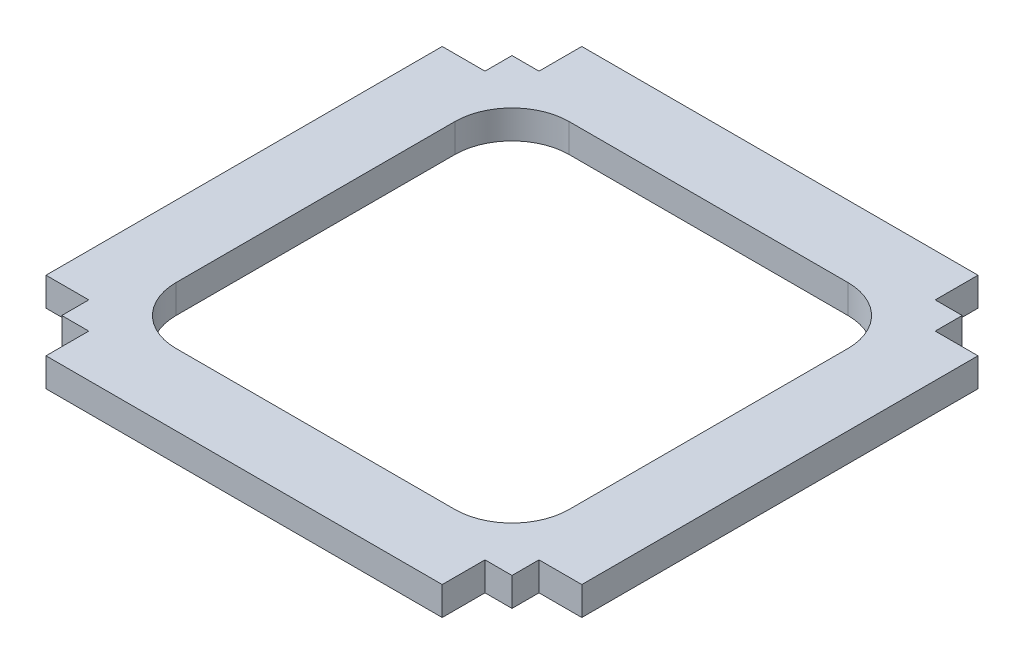
ISO-10303-21;
HEADER;
FILE_DESCRIPTION(('STEP AP214'),'2;1');
FILE_NAME('part.step','',(''),(''),'','','');
FILE_SCHEMA(('AUTOMOTIVE_DESIGN { 1 0 10303 214 1 1 1 1 }'));
ENDSEC;
DATA;
#1=APPLICATION_CONTEXT('core data for automotive mechanical design processes');
#2=APPLICATION_PROTOCOL_DEFINITION('international standard','automotive_design',2000,#1);
#3=PRODUCT_CONTEXT('',#1,'mechanical');
#4=PRODUCT('Part','Part','',(#3));
#5=PRODUCT_RELATED_PRODUCT_CATEGORY('part','',(#4));
#6=PRODUCT_DEFINITION_FORMATION('','',#4);
#7=PRODUCT_DEFINITION_CONTEXT('part definition',#1,'design');
#8=PRODUCT_DEFINITION('design','',#6,#7);
#9=PRODUCT_DEFINITION_SHAPE('','',#8);
#10=(LENGTH_UNIT() NAMED_UNIT(*) SI_UNIT(.MILLI.,.METRE.));
#11=(NAMED_UNIT(*) PLANE_ANGLE_UNIT() SI_UNIT($,.RADIAN.));
#12=(NAMED_UNIT(*) SI_UNIT($,.STERADIAN.) SOLID_ANGLE_UNIT());
#13=UNCERTAINTY_MEASURE_WITH_UNIT(LENGTH_MEASURE(1.E-05),#10,'distance_accuracy_value','');
#14=(GEOMETRIC_REPRESENTATION_CONTEXT(3) GLOBAL_UNCERTAINTY_ASSIGNED_CONTEXT((#13)) GLOBAL_UNIT_ASSIGNED_CONTEXT((#10,
#11,#12)) REPRESENTATION_CONTEXT('',''));
#15=CARTESIAN_POINT('',(0.,0.,0.));
#16=DIRECTION('',(0.,0.,1.));
#17=DIRECTION('',(1.,0.,0.));
#18=AXIS2_PLACEMENT_3D('',#15,#16,#17);
#19=CARTESIAN_POINT('',(-50.,6.35,-44.));
#20=DIRECTION('',(1.,0.,0.));
#21=DIRECTION('',(0.,0.,-1.));
#22=AXIS2_PLACEMENT_3D('',#19,#20,#21);
#23=PLANE('',#22);
#24=DIRECTION('',(0.,0.,1.));
#25=VECTOR('',#24,1.);
#26=CARTESIAN_POINT('',(-50.,0.,-44.));
#27=LINE('',#26,#25);
#28=CARTESIAN_POINT('',(-50.,0.,-50.));
#29=VERTEX_POINT('',#28);
#30=CARTESIAN_POINT('',(-50.,0.,-44.));
#31=VERTEX_POINT('',#30);
#32=EDGE_CURVE('E243',#29,#31,#27,.T.);
#33=ORIENTED_EDGE('',*,*,#32,.T.);
#34=DIRECTION('',(0.,-1.,0.));
#35=VECTOR('',#34,1.);
#36=CARTESIAN_POINT('',(-50.,6.35,-44.));
#37=LINE('',#36,#35);
#38=CARTESIAN_POINT('',(-50.,6.35,-44.));
#39=VERTEX_POINT('',#38);
#40=EDGE_CURVE('E224',#39,#31,#37,.T.);
#41=ORIENTED_EDGE('',*,*,#40,.F.);
#42=DIRECTION('',(0.,0.,1.));
#43=VECTOR('',#42,1.);
#44=CARTESIAN_POINT('',(-50.,6.35,-44.));
#45=LINE('',#44,#43);
#46=CARTESIAN_POINT('',(-50.,6.35,-50.));
#47=VERTEX_POINT('',#46);
#48=EDGE_CURVE('E231',#47,#39,#45,.T.);
#49=ORIENTED_EDGE('',*,*,#48,.F.);
#50=DIRECTION('',(0.,-1.,0.));
#51=VECTOR('',#50,1.);
#52=CARTESIAN_POINT('',(-50.,6.35,-50.));
#53=LINE('',#52,#51);
#54=EDGE_CURVE('E349',#47,#29,#53,.T.);
#55=ORIENTED_EDGE('',*,*,#54,.T.);
#56=EDGE_LOOP('',(#33,#41,#49,#55));
#57=FACE_BOUND('',#56,.T.);
#58=ADVANCED_FACE('F34',(#57),#23,.F.);
#59=CARTESIAN_POINT('',(-50.,6.35,-44.));
#60=DIRECTION('',(0.,0.,1.));
#61=DIRECTION('',(1.,0.,0.));
#62=AXIS2_PLACEMENT_3D('',#59,#60,#61);
#63=PLANE('',#62);
#64=DIRECTION('',(-1.,0.,0.));
#65=VECTOR('',#64,1.);
#66=CARTESIAN_POINT('',(-50.,0.,-44.));
#67=LINE('',#66,#65);
#68=CARTESIAN_POINT('',(-59.5,0.,-44.));
#69=VERTEX_POINT('',#68);
#70=EDGE_CURVE('E351',#31,#69,#67,.T.);
#71=ORIENTED_EDGE('',*,*,#70,.T.);
#72=DIRECTION('',(0.,-1.,0.));
#73=VECTOR('',#72,1.);
#74=CARTESIAN_POINT('',(-59.5,6.35,-44.));
#75=LINE('',#74,#73);
#76=CARTESIAN_POINT('',(-59.5,6.35,-44.));
#77=VERTEX_POINT('',#76);
#78=EDGE_CURVE('E227',#77,#69,#75,.T.);
#79=ORIENTED_EDGE('',*,*,#78,.F.);
#80=DIRECTION('',(-1.,0.,0.));
#81=VECTOR('',#80,1.);
#82=CARTESIAN_POINT('',(-50.,6.35,-44.));
#83=LINE('',#82,#81);
#84=EDGE_CURVE('E220',#39,#77,#83,.T.);
#85=ORIENTED_EDGE('',*,*,#84,.F.);
#86=ORIENTED_EDGE('',*,*,#40,.T.);
#87=EDGE_LOOP('',(#71,#79,#85,#86));
#88=FACE_BOUND('',#87,.T.);
#89=ADVANCED_FACE('F222',(#88),#63,.F.);
#90=CARTESIAN_POINT('',(-59.5,6.35,44.));
#91=DIRECTION('',(1.,0.,0.));
#92=DIRECTION('',(0.,0.,-1.));
#93=AXIS2_PLACEMENT_3D('',#90,#91,#92);
#94=PLANE('',#93);
#95=DIRECTION('',(0.,0.,1.));
#96=VECTOR('',#95,1.);
#97=CARTESIAN_POINT('',(-59.5,0.,44.));
#98=LINE('',#97,#96);
#99=CARTESIAN_POINT('',(-59.5,0.,44.));
#100=VERTEX_POINT('',#99);
#101=EDGE_CURVE('E353',#69,#100,#98,.T.);
#102=ORIENTED_EDGE('',*,*,#101,.T.);
#103=DIRECTION('',(0.,-1.,0.));
#104=VECTOR('',#103,1.);
#105=CARTESIAN_POINT('',(-59.5,6.35,44.));
#106=LINE('',#105,#104);
#107=CARTESIAN_POINT('',(-59.5,6.35,44.));
#108=VERTEX_POINT('',#107);
#109=EDGE_CURVE('E248',#108,#100,#106,.T.);
#110=ORIENTED_EDGE('',*,*,#109,.F.);
#111=DIRECTION('',(0.,0.,1.));
#112=VECTOR('',#111,1.);
#113=CARTESIAN_POINT('',(-59.5,6.35,44.));
#114=LINE('',#113,#112);
#115=EDGE_CURVE('E230',#77,#108,#114,.T.);
#116=ORIENTED_EDGE('',*,*,#115,.F.);
#117=ORIENTED_EDGE('',*,*,#78,.T.);
#118=EDGE_LOOP('',(#102,#110,#116,#117));
#119=FACE_BOUND('',#118,.T.);
#120=ADVANCED_FACE('F458',(#119),#94,.F.);
#121=CARTESIAN_POINT('',(-50.,6.35,44.));
#122=DIRECTION('',(0.,0.,-1.));
#123=DIRECTION('',(-1.,0.,0.));
#124=AXIS2_PLACEMENT_3D('',#121,#122,#123);
#125=PLANE('',#124);
#126=DIRECTION('',(1.,0.,0.));
#127=VECTOR('',#126,1.);
#128=CARTESIAN_POINT('',(-50.,0.,44.));
#129=LINE('',#128,#127);
#130=CARTESIAN_POINT('',(-50.,0.,44.));
#131=VERTEX_POINT('',#130);
#132=EDGE_CURVE('E355',#100,#131,#129,.T.);
#133=ORIENTED_EDGE('',*,*,#132,.T.);
#134=DIRECTION('',(0.,-1.,0.));
#135=VECTOR('',#134,1.);
#136=CARTESIAN_POINT('',(-50.,6.35,44.));
#137=LINE('',#136,#135);
#138=CARTESIAN_POINT('',(-50.,6.35,44.));
#139=VERTEX_POINT('',#138);
#140=EDGE_CURVE('E434',#139,#131,#137,.T.);
#141=ORIENTED_EDGE('',*,*,#140,.F.);
#142=DIRECTION('',(1.,0.,0.));
#143=VECTOR('',#142,1.);
#144=CARTESIAN_POINT('',(-50.,6.35,44.));
#145=LINE('',#144,#143);
#146=EDGE_CURVE('E316',#108,#139,#145,.T.);
#147=ORIENTED_EDGE('',*,*,#146,.F.);
#148=ORIENTED_EDGE('',*,*,#109,.T.);
#149=EDGE_LOOP('',(#133,#141,#147,#148));
#150=FACE_BOUND('',#149,.T.);
#151=ADVANCED_FACE('F441',(#150),#125,.F.);
#152=CARTESIAN_POINT('',(-50.,6.35,50.));
#153=DIRECTION('',(1.,0.,0.));
#154=DIRECTION('',(0.,0.,-1.));
#155=AXIS2_PLACEMENT_3D('',#152,#153,#154);
#156=PLANE('',#155);
#157=DIRECTION('',(0.,0.,1.));
#158=VECTOR('',#157,1.);
#159=CARTESIAN_POINT('',(-50.,0.,50.));
#160=LINE('',#159,#158);
#161=CARTESIAN_POINT('',(-50.,0.,50.));
#162=VERTEX_POINT('',#161);
#163=EDGE_CURVE('E357',#131,#162,#160,.T.);
#164=ORIENTED_EDGE('',*,*,#163,.T.);
#165=DIRECTION('',(0.,-1.,0.));
#166=VECTOR('',#165,1.);
#167=CARTESIAN_POINT('',(-50.,6.35,50.));
#168=LINE('',#167,#166);
#169=CARTESIAN_POINT('',(-50.,6.35,50.));
#170=VERTEX_POINT('',#169);
#171=EDGE_CURVE('E431',#170,#162,#168,.T.);
#172=ORIENTED_EDGE('',*,*,#171,.F.);
#173=DIRECTION('',(0.,0.,1.));
#174=VECTOR('',#173,1.);
#175=CARTESIAN_POINT('',(-50.,6.35,50.));
#176=LINE('',#175,#174);
#177=EDGE_CURVE('E318',#139,#170,#176,.T.);
#178=ORIENTED_EDGE('',*,*,#177,.F.);
#179=ORIENTED_EDGE('',*,*,#140,.T.);
#180=EDGE_LOOP('',(#164,#172,#178,#179));
#181=FACE_BOUND('',#180,.T.);
#182=ADVANCED_FACE('F450',(#181),#156,.F.);
#183=CARTESIAN_POINT('',(-44.,6.35,50.));
#184=DIRECTION('',(0.,0.,-1.));
#185=DIRECTION('',(-1.,0.,0.));
#186=AXIS2_PLACEMENT_3D('',#183,#184,#185);
#187=PLANE('',#186);
#188=DIRECTION('',(1.,0.,0.));
#189=VECTOR('',#188,1.);
#190=CARTESIAN_POINT('',(-44.,0.,50.));
#191=LINE('',#190,#189);
#192=CARTESIAN_POINT('',(-44.,0.,50.));
#193=VERTEX_POINT('',#192);
#194=EDGE_CURVE('E359',#162,#193,#191,.T.);
#195=ORIENTED_EDGE('',*,*,#194,.T.);
#196=DIRECTION('',(0.,-1.,0.));
#197=VECTOR('',#196,1.);
#198=CARTESIAN_POINT('',(-44.,6.35,50.));
#199=LINE('',#198,#197);
#200=CARTESIAN_POINT('',(-44.,6.35,50.));
#201=VERTEX_POINT('',#200);
#202=EDGE_CURVE('E428',#201,#193,#199,.T.);
#203=ORIENTED_EDGE('',*,*,#202,.F.);
#204=DIRECTION('',(1.,0.,0.));
#205=VECTOR('',#204,1.);
#206=CARTESIAN_POINT('',(-44.,6.35,50.));
#207=LINE('',#206,#205);
#208=EDGE_CURVE('E320',#170,#201,#207,.T.);
#209=ORIENTED_EDGE('',*,*,#208,.F.);
#210=ORIENTED_EDGE('',*,*,#171,.T.);
#211=EDGE_LOOP('',(#195,#203,#209,#210));
#212=FACE_BOUND('',#211,.T.);
#213=ADVANCED_FACE('F454',(#212),#187,.F.);
#214=CARTESIAN_POINT('',(-44.,6.35,59.5));
#215=DIRECTION('',(1.,0.,0.));
#216=DIRECTION('',(0.,0.,-1.));
#217=AXIS2_PLACEMENT_3D('',#214,#215,#216);
#218=PLANE('',#217);
#219=DIRECTION('',(0.,0.,1.));
#220=VECTOR('',#219,1.);
#221=CARTESIAN_POINT('',(-44.,0.,59.5));
#222=LINE('',#221,#220);
#223=CARTESIAN_POINT('',(-44.,0.,59.5));
#224=VERTEX_POINT('',#223);
#225=EDGE_CURVE('E361',#193,#224,#222,.T.);
#226=ORIENTED_EDGE('',*,*,#225,.T.);
#227=DIRECTION('',(0.,-1.,0.));
#228=VECTOR('',#227,1.);
#229=CARTESIAN_POINT('',(-44.,6.35,59.5));
#230=LINE('',#229,#228);
#231=CARTESIAN_POINT('',(-44.,6.35,59.5));
#232=VERTEX_POINT('',#231);
#233=EDGE_CURVE('E425',#232,#224,#230,.T.);
#234=ORIENTED_EDGE('',*,*,#233,.F.);
#235=DIRECTION('',(0.,0.,1.));
#236=VECTOR('',#235,1.);
#237=CARTESIAN_POINT('',(-44.,6.35,59.5));
#238=LINE('',#237,#236);
#239=EDGE_CURVE('E322',#201,#232,#238,.T.);
#240=ORIENTED_EDGE('',*,*,#239,.F.);
#241=ORIENTED_EDGE('',*,*,#202,.T.);
#242=EDGE_LOOP('',(#226,#234,#240,#241));
#243=FACE_BOUND('',#242,.T.);
#244=ADVANCED_FACE('F563',(#243),#218,.F.);
#245=CARTESIAN_POINT('',(44.,6.35,59.5));
#246=DIRECTION('',(0.,0.,-1.));
#247=DIRECTION('',(-1.,0.,0.));
#248=AXIS2_PLACEMENT_3D('',#245,#246,#247);
#249=PLANE('',#248);
#250=DIRECTION('',(1.,0.,0.));
#251=VECTOR('',#250,1.);
#252=CARTESIAN_POINT('',(44.,0.,59.5));
#253=LINE('',#252,#251);
#254=CARTESIAN_POINT('',(44.,0.,59.5));
#255=VERTEX_POINT('',#254);
#256=EDGE_CURVE('E363',#224,#255,#253,.T.);
#257=ORIENTED_EDGE('',*,*,#256,.T.);
#258=DIRECTION('',(0.,-1.,0.));
#259=VECTOR('',#258,1.);
#260=CARTESIAN_POINT('',(44.,6.35,59.5));
#261=LINE('',#260,#259);
#262=CARTESIAN_POINT('',(44.,6.35,59.5));
#263=VERTEX_POINT('',#262);
#264=EDGE_CURVE('E422',#263,#255,#261,.T.);
#265=ORIENTED_EDGE('',*,*,#264,.F.);
#266=DIRECTION('',(1.,0.,0.));
#267=VECTOR('',#266,1.);
#268=CARTESIAN_POINT('',(44.,6.35,59.5));
#269=LINE('',#268,#267);
#270=EDGE_CURVE('E324',#232,#263,#269,.T.);
#271=ORIENTED_EDGE('',*,*,#270,.F.);
#272=ORIENTED_EDGE('',*,*,#233,.T.);
#273=EDGE_LOOP('',(#257,#265,#271,#272));
#274=FACE_BOUND('',#273,.T.);
#275=ADVANCED_FACE('F559',(#274),#249,.F.);
#276=CARTESIAN_POINT('',(44.,6.35,59.5));
#277=DIRECTION('',(-1.,0.,0.));
#278=DIRECTION('',(0.,0.,1.));
#279=AXIS2_PLACEMENT_3D('',#276,#277,#278);
#280=PLANE('',#279);
#281=DIRECTION('',(0.,0.,-1.));
#282=VECTOR('',#281,1.);
#283=CARTESIAN_POINT('',(44.,0.,59.5));
#284=LINE('',#283,#282);
#285=CARTESIAN_POINT('',(44.,0.,50.));
#286=VERTEX_POINT('',#285);
#287=EDGE_CURVE('E365',#255,#286,#284,.T.);
#288=ORIENTED_EDGE('',*,*,#287,.T.);
#289=DIRECTION('',(0.,-1.,0.));
#290=VECTOR('',#289,1.);
#291=CARTESIAN_POINT('',(44.,6.35,50.));
#292=LINE('',#291,#290);
#293=CARTESIAN_POINT('',(44.,6.35,50.));
#294=VERTEX_POINT('',#293);
#295=EDGE_CURVE('E419',#294,#286,#292,.T.);
#296=ORIENTED_EDGE('',*,*,#295,.F.);
#297=DIRECTION('',(0.,0.,-1.));
#298=VECTOR('',#297,1.);
#299=CARTESIAN_POINT('',(44.,6.35,59.5));
#300=LINE('',#299,#298);
#301=EDGE_CURVE('E326',#263,#294,#300,.T.);
#302=ORIENTED_EDGE('',*,*,#301,.F.);
#303=ORIENTED_EDGE('',*,*,#264,.T.);
#304=EDGE_LOOP('',(#288,#296,#302,#303));
#305=FACE_BOUND('',#304,.T.);
#306=ADVANCED_FACE('F555',(#305),#280,.F.);
#307=CARTESIAN_POINT('',(50.,6.35,50.));
#308=DIRECTION('',(0.,0.,-1.));
#309=DIRECTION('',(-1.,0.,0.));
#310=AXIS2_PLACEMENT_3D('',#307,#308,#309);
#311=PLANE('',#310);
#312=DIRECTION('',(1.,0.,0.));
#313=VECTOR('',#312,1.);
#314=CARTESIAN_POINT('',(50.,0.,50.));
#315=LINE('',#314,#313);
#316=CARTESIAN_POINT('',(50.,0.,50.));
#317=VERTEX_POINT('',#316);
#318=EDGE_CURVE('E367',#286,#317,#315,.T.);
#319=ORIENTED_EDGE('',*,*,#318,.T.);
#320=DIRECTION('',(0.,-1.,0.));
#321=VECTOR('',#320,1.);
#322=CARTESIAN_POINT('',(50.,6.35,50.));
#323=LINE('',#322,#321);
#324=CARTESIAN_POINT('',(50.,6.35,50.));
#325=VERTEX_POINT('',#324);
#326=EDGE_CURVE('E416',#325,#317,#323,.T.);
#327=ORIENTED_EDGE('',*,*,#326,.F.);
#328=DIRECTION('',(1.,0.,0.));
#329=VECTOR('',#328,1.);
#330=CARTESIAN_POINT('',(50.,6.35,50.));
#331=LINE('',#330,#329);
#332=EDGE_CURVE('E328',#294,#325,#331,.T.);
#333=ORIENTED_EDGE('',*,*,#332,.F.);
#334=ORIENTED_EDGE('',*,*,#295,.T.);
#335=EDGE_LOOP('',(#319,#327,#333,#334));
#336=FACE_BOUND('',#335,.T.);
#337=ADVANCED_FACE('F551',(#336),#311,.F.);
#338=CARTESIAN_POINT('',(50.,6.35,50.));
#339=DIRECTION('',(-1.,0.,0.));
#340=DIRECTION('',(0.,0.,1.));
#341=AXIS2_PLACEMENT_3D('',#338,#339,#340);
#342=PLANE('',#341);
#343=DIRECTION('',(0.,0.,-1.));
#344=VECTOR('',#343,1.);
#345=CARTESIAN_POINT('',(50.,0.,50.));
#346=LINE('',#345,#344);
#347=CARTESIAN_POINT('',(50.,0.,44.));
#348=VERTEX_POINT('',#347);
#349=EDGE_CURVE('E369',#317,#348,#346,.T.);
#350=ORIENTED_EDGE('',*,*,#349,.T.);
#351=DIRECTION('',(0.,-1.,0.));
#352=VECTOR('',#351,1.);
#353=CARTESIAN_POINT('',(50.,6.35,44.));
#354=LINE('',#353,#352);
#355=CARTESIAN_POINT('',(50.,6.35,44.));
#356=VERTEX_POINT('',#355);
#357=EDGE_CURVE('E413',#356,#348,#354,.T.);
#358=ORIENTED_EDGE('',*,*,#357,.F.);
#359=DIRECTION('',(0.,0.,-1.));
#360=VECTOR('',#359,1.);
#361=CARTESIAN_POINT('',(50.,6.35,50.));
#362=LINE('',#361,#360);
#363=EDGE_CURVE('E330',#325,#356,#362,.T.);
#364=ORIENTED_EDGE('',*,*,#363,.F.);
#365=ORIENTED_EDGE('',*,*,#326,.T.);
#366=EDGE_LOOP('',(#350,#358,#364,#365));
#367=FACE_BOUND('',#366,.T.);
#368=ADVANCED_FACE('F547',(#367),#342,.F.);
#369=CARTESIAN_POINT('',(59.5,6.35,44.));
#370=DIRECTION('',(0.,0.,-1.));
#371=DIRECTION('',(-1.,0.,0.));
#372=AXIS2_PLACEMENT_3D('',#369,#370,#371);
#373=PLANE('',#372);
#374=DIRECTION('',(1.,0.,0.));
#375=VECTOR('',#374,1.);
#376=CARTESIAN_POINT('',(59.5,0.,44.));
#377=LINE('',#376,#375);
#378=CARTESIAN_POINT('',(59.5,0.,44.));
#379=VERTEX_POINT('',#378);
#380=EDGE_CURVE('E371',#348,#379,#377,.T.);
#381=ORIENTED_EDGE('',*,*,#380,.T.);
#382=DIRECTION('',(0.,-1.,0.));
#383=VECTOR('',#382,1.);
#384=CARTESIAN_POINT('',(59.5,6.35,44.));
#385=LINE('',#384,#383);
#386=CARTESIAN_POINT('',(59.5,6.35,44.));
#387=VERTEX_POINT('',#386);
#388=EDGE_CURVE('E410',#387,#379,#385,.T.);
#389=ORIENTED_EDGE('',*,*,#388,.F.);
#390=DIRECTION('',(1.,0.,0.));
#391=VECTOR('',#390,1.);
#392=CARTESIAN_POINT('',(59.5,6.35,44.));
#393=LINE('',#392,#391);
#394=EDGE_CURVE('E332',#356,#387,#393,.T.);
#395=ORIENTED_EDGE('',*,*,#394,.F.);
#396=ORIENTED_EDGE('',*,*,#357,.T.);
#397=EDGE_LOOP('',(#381,#389,#395,#396));
#398=FACE_BOUND('',#397,.T.);
#399=ADVANCED_FACE('F543',(#398),#373,.F.);
#400=CARTESIAN_POINT('',(59.5,6.35,44.));
#401=DIRECTION('',(-1.,0.,0.));
#402=DIRECTION('',(0.,0.,1.));
#403=AXIS2_PLACEMENT_3D('',#400,#401,#402);
#404=PLANE('',#403);
#405=DIRECTION('',(0.,0.,-1.));
#406=VECTOR('',#405,1.);
#407=CARTESIAN_POINT('',(59.5,0.,44.));
#408=LINE('',#407,#406);
#409=CARTESIAN_POINT('',(59.5,0.,-44.));
#410=VERTEX_POINT('',#409);
#411=EDGE_CURVE('E373',#379,#410,#408,.T.);
#412=ORIENTED_EDGE('',*,*,#411,.T.);
#413=DIRECTION('',(0.,-1.,0.));
#414=VECTOR('',#413,1.);
#415=CARTESIAN_POINT('',(59.5,6.35,-44.));
#416=LINE('',#415,#414);
#417=CARTESIAN_POINT('',(59.5,6.35,-44.));
#418=VERTEX_POINT('',#417);
#419=EDGE_CURVE('E407',#418,#410,#416,.T.);
#420=ORIENTED_EDGE('',*,*,#419,.F.);
#421=DIRECTION('',(0.,0.,-1.));
#422=VECTOR('',#421,1.);
#423=CARTESIAN_POINT('',(59.5,6.35,44.));
#424=LINE('',#423,#422);
#425=EDGE_CURVE('E334',#387,#418,#424,.T.);
#426=ORIENTED_EDGE('',*,*,#425,.F.);
#427=ORIENTED_EDGE('',*,*,#388,.T.);
#428=EDGE_LOOP('',(#412,#420,#426,#427));
#429=FACE_BOUND('',#428,.T.);
#430=ADVANCED_FACE('F539',(#429),#404,.F.);
#431=CARTESIAN_POINT('',(59.5,6.35,-44.));
#432=DIRECTION('',(0.,0.,1.));
#433=DIRECTION('',(1.,0.,0.));
#434=AXIS2_PLACEMENT_3D('',#431,#432,#433);
#435=PLANE('',#434);
#436=DIRECTION('',(-1.,0.,0.));
#437=VECTOR('',#436,1.);
#438=CARTESIAN_POINT('',(59.5,0.,-44.));
#439=LINE('',#438,#437);
#440=CARTESIAN_POINT('',(50.,0.,-44.));
#441=VERTEX_POINT('',#440);
#442=EDGE_CURVE('E375',#410,#441,#439,.T.);
#443=ORIENTED_EDGE('',*,*,#442,.T.);
#444=DIRECTION('',(0.,-1.,0.));
#445=VECTOR('',#444,1.);
#446=CARTESIAN_POINT('',(50.,6.35,-44.));
#447=LINE('',#446,#445);
#448=CARTESIAN_POINT('',(50.,6.35,-44.));
#449=VERTEX_POINT('',#448);
#450=EDGE_CURVE('E404',#449,#441,#447,.T.);
#451=ORIENTED_EDGE('',*,*,#450,.F.);
#452=DIRECTION('',(-1.,0.,0.));
#453=VECTOR('',#452,1.);
#454=CARTESIAN_POINT('',(59.5,6.35,-44.));
#455=LINE('',#454,#453);
#456=EDGE_CURVE('E336',#418,#449,#455,.T.);
#457=ORIENTED_EDGE('',*,*,#456,.F.);
#458=ORIENTED_EDGE('',*,*,#419,.T.);
#459=EDGE_LOOP('',(#443,#451,#457,#458));
#460=FACE_BOUND('',#459,.T.);
#461=ADVANCED_FACE('F535',(#460),#435,.F.);
#462=CARTESIAN_POINT('',(50.,6.35,-44.));
#463=DIRECTION('',(-1.,0.,0.));
#464=DIRECTION('',(0.,0.,1.));
#465=AXIS2_PLACEMENT_3D('',#462,#463,#464);
#466=PLANE('',#465);
#467=DIRECTION('',(0.,0.,-1.));
#468=VECTOR('',#467,1.);
#469=CARTESIAN_POINT('',(50.,0.,-44.));
#470=LINE('',#469,#468);
#471=CARTESIAN_POINT('',(50.,0.,-50.));
#472=VERTEX_POINT('',#471);
#473=EDGE_CURVE('E377',#441,#472,#470,.T.);
#474=ORIENTED_EDGE('',*,*,#473,.T.);
#475=DIRECTION('',(0.,-1.,0.));
#476=VECTOR('',#475,1.);
#477=CARTESIAN_POINT('',(50.,6.35,-50.));
#478=LINE('',#477,#476);
#479=CARTESIAN_POINT('',(50.,6.35,-50.));
#480=VERTEX_POINT('',#479);
#481=EDGE_CURVE('E401',#480,#472,#478,.T.);
#482=ORIENTED_EDGE('',*,*,#481,.F.);
#483=DIRECTION('',(0.,0.,-1.));
#484=VECTOR('',#483,1.);
#485=CARTESIAN_POINT('',(50.,6.35,-44.));
#486=LINE('',#485,#484);
#487=EDGE_CURVE('E338',#449,#480,#486,.T.);
#488=ORIENTED_EDGE('',*,*,#487,.F.);
#489=ORIENTED_EDGE('',*,*,#450,.T.);
#490=EDGE_LOOP('',(#474,#482,#488,#489));
#491=FACE_BOUND('',#490,.T.);
#492=ADVANCED_FACE('F531',(#491),#466,.F.);
#493=CARTESIAN_POINT('',(50.,6.35,-50.));
#494=DIRECTION('',(0.,0.,1.));
#495=DIRECTION('',(1.,0.,0.));
#496=AXIS2_PLACEMENT_3D('',#493,#494,#495);
#497=PLANE('',#496);
#498=DIRECTION('',(-1.,0.,0.));
#499=VECTOR('',#498,1.);
#500=CARTESIAN_POINT('',(50.,0.,-50.));
#501=LINE('',#500,#499);
#502=CARTESIAN_POINT('',(44.,0.,-50.));
#503=VERTEX_POINT('',#502);
#504=EDGE_CURVE('E379',#472,#503,#501,.T.);
#505=ORIENTED_EDGE('',*,*,#504,.T.);
#506=DIRECTION('',(0.,-1.,0.));
#507=VECTOR('',#506,1.);
#508=CARTESIAN_POINT('',(44.,6.35,-50.));
#509=LINE('',#508,#507);
#510=CARTESIAN_POINT('',(44.,6.35,-50.));
#511=VERTEX_POINT('',#510);
#512=EDGE_CURVE('E398',#511,#503,#509,.T.);
#513=ORIENTED_EDGE('',*,*,#512,.F.);
#514=DIRECTION('',(-1.,0.,0.));
#515=VECTOR('',#514,1.);
#516=CARTESIAN_POINT('',(50.,6.35,-50.));
#517=LINE('',#516,#515);
#518=EDGE_CURVE('E340',#480,#511,#517,.T.);
#519=ORIENTED_EDGE('',*,*,#518,.F.);
#520=ORIENTED_EDGE('',*,*,#481,.T.);
#521=EDGE_LOOP('',(#505,#513,#519,#520));
#522=FACE_BOUND('',#521,.T.);
#523=ADVANCED_FACE('F527',(#522),#497,.F.);
#524=CARTESIAN_POINT('',(44.,6.35,-50.));
#525=DIRECTION('',(-1.,0.,0.));
#526=DIRECTION('',(0.,0.,1.));
#527=AXIS2_PLACEMENT_3D('',#524,#525,#526);
#528=PLANE('',#527);
#529=DIRECTION('',(0.,0.,-1.));
#530=VECTOR('',#529,1.);
#531=CARTESIAN_POINT('',(44.,0.,-50.));
#532=LINE('',#531,#530);
#533=CARTESIAN_POINT('',(44.,0.,-59.5));
#534=VERTEX_POINT('',#533);
#535=EDGE_CURVE('E381',#503,#534,#532,.T.);
#536=ORIENTED_EDGE('',*,*,#535,.T.);
#537=DIRECTION('',(0.,-1.,0.));
#538=VECTOR('',#537,1.);
#539=CARTESIAN_POINT('',(44.,6.35,-59.5));
#540=LINE('',#539,#538);
#541=CARTESIAN_POINT('',(44.,6.35,-59.5));
#542=VERTEX_POINT('',#541);
#543=EDGE_CURVE('E395',#542,#534,#540,.T.);
#544=ORIENTED_EDGE('',*,*,#543,.F.);
#545=DIRECTION('',(0.,0.,-1.));
#546=VECTOR('',#545,1.);
#547=CARTESIAN_POINT('',(44.,6.35,-50.));
#548=LINE('',#547,#546);
#549=EDGE_CURVE('E342',#511,#542,#548,.T.);
#550=ORIENTED_EDGE('',*,*,#549,.F.);
#551=ORIENTED_EDGE('',*,*,#512,.T.);
#552=EDGE_LOOP('',(#536,#544,#550,#551));
#553=FACE_BOUND('',#552,.T.);
#554=ADVANCED_FACE('F523',(#553),#528,.F.);
#555=CARTESIAN_POINT('',(44.,6.35,-59.5));
#556=DIRECTION('',(0.,0.,1.));
#557=DIRECTION('',(1.,0.,0.));
#558=AXIS2_PLACEMENT_3D('',#555,#556,#557);
#559=PLANE('',#558);
#560=DIRECTION('',(-1.,0.,0.));
#561=VECTOR('',#560,1.);
#562=CARTESIAN_POINT('',(44.,0.,-59.5));
#563=LINE('',#562,#561);
#564=CARTESIAN_POINT('',(-44.,0.,-59.5));
#565=VERTEX_POINT('',#564);
#566=EDGE_CURVE('E383',#534,#565,#563,.T.);
#567=ORIENTED_EDGE('',*,*,#566,.T.);
#568=DIRECTION('',(0.,-1.,0.));
#569=VECTOR('',#568,1.);
#570=CARTESIAN_POINT('',(-44.,6.35,-59.5));
#571=LINE('',#570,#569);
#572=CARTESIAN_POINT('',(-44.,6.35,-59.5));
#573=VERTEX_POINT('',#572);
#574=EDGE_CURVE('E392',#573,#565,#571,.T.);
#575=ORIENTED_EDGE('',*,*,#574,.F.);
#576=DIRECTION('',(-1.,0.,0.));
#577=VECTOR('',#576,1.);
#578=CARTESIAN_POINT('',(44.,6.35,-59.5));
#579=LINE('',#578,#577);
#580=EDGE_CURVE('E344',#542,#573,#579,.T.);
#581=ORIENTED_EDGE('',*,*,#580,.F.);
#582=ORIENTED_EDGE('',*,*,#543,.T.);
#583=EDGE_LOOP('',(#567,#575,#581,#582));
#584=FACE_BOUND('',#583,.T.);
#585=ADVANCED_FACE('F519',(#584),#559,.F.);
#586=CARTESIAN_POINT('',(-44.,6.35,-50.));
#587=DIRECTION('',(1.,0.,0.));
#588=DIRECTION('',(0.,0.,-1.));
#589=AXIS2_PLACEMENT_3D('',#586,#587,#588);
#590=PLANE('',#589);
#591=DIRECTION('',(0.,0.,1.));
#592=VECTOR('',#591,1.);
#593=CARTESIAN_POINT('',(-44.,0.,-50.));
#594=LINE('',#593,#592);
#595=CARTESIAN_POINT('',(-44.,0.,-50.));
#596=VERTEX_POINT('',#595);
#597=EDGE_CURVE('E385',#565,#596,#594,.T.);
#598=ORIENTED_EDGE('',*,*,#597,.T.);
#599=DIRECTION('',(0.,-1.,0.));
#600=VECTOR('',#599,1.);
#601=CARTESIAN_POINT('',(-44.,6.35,-50.));
#602=LINE('',#601,#600);
#603=CARTESIAN_POINT('',(-44.,6.35,-50.));
#604=VERTEX_POINT('',#603);
#605=EDGE_CURVE('E389',#604,#596,#602,.T.);
#606=ORIENTED_EDGE('',*,*,#605,.F.);
#607=DIRECTION('',(0.,0.,1.));
#608=VECTOR('',#607,1.);
#609=CARTESIAN_POINT('',(-44.,6.35,-50.));
#610=LINE('',#609,#608);
#611=EDGE_CURVE('E346',#573,#604,#610,.T.);
#612=ORIENTED_EDGE('',*,*,#611,.F.);
#613=ORIENTED_EDGE('',*,*,#574,.T.);
#614=EDGE_LOOP('',(#598,#606,#612,#613));
#615=FACE_BOUND('',#614,.T.);
#616=ADVANCED_FACE('F515',(#615),#590,.F.);
#617=CARTESIAN_POINT('',(-44.,6.35,-50.));
#618=DIRECTION('',(0.,0.,1.));
#619=DIRECTION('',(1.,0.,0.));
#620=AXIS2_PLACEMENT_3D('',#617,#618,#619);
#621=PLANE('',#620);
#622=DIRECTION('',(-1.,0.,0.));
#623=VECTOR('',#622,1.);
#624=CARTESIAN_POINT('',(-44.,0.,-50.));
#625=LINE('',#624,#623);
#626=EDGE_CURVE('E240',#596,#29,#625,.T.);
#627=ORIENTED_EDGE('',*,*,#626,.T.);
#628=ORIENTED_EDGE('',*,*,#54,.F.);
#629=DIRECTION('',(-1.,0.,0.));
#630=VECTOR('',#629,1.);
#631=CARTESIAN_POINT('',(-44.,6.35,-50.));
#632=LINE('',#631,#630);
#633=EDGE_CURVE('E236',#604,#47,#632,.T.);
#634=ORIENTED_EDGE('',*,*,#633,.F.);
#635=ORIENTED_EDGE('',*,*,#605,.T.);
#636=EDGE_LOOP('',(#627,#628,#634,#635));
#637=FACE_BOUND('',#636,.T.);
#638=ADVANCED_FACE('F510',(#637),#621,.F.);
#639=CARTESIAN_POINT('',(0.,6.35,0.));
#640=DIRECTION('',(0.,1.,0.));
#641=DIRECTION('',(0.,0.,1.));
#642=AXIS2_PLACEMENT_3D('',#639,#640,#641);
#643=PLANE('',#642);
#644=DIRECTION('',(0.,0.,1.));
#645=VECTOR('',#644,1.);
#646=CARTESIAN_POINT('',(-43.65,6.35,43.65));
#647=LINE('',#646,#645);
#648=CARTESIAN_POINT('',(-43.65,6.35,-30.95));
#649=VERTEX_POINT('',#648);
#650=CARTESIAN_POINT('',(-43.65,6.35,30.95));
#651=VERTEX_POINT('',#650);
#652=EDGE_CURVE('E283',#649,#651,#647,.T.);
#653=ORIENTED_EDGE('',*,*,#652,.F.);
#654=CARTESIAN_POINT('',(-30.95,6.35,-30.95));
#655=DIRECTION('',(0.,1.,0.));
#656=DIRECTION('',(0.,0.,1.));
#657=AXIS2_PLACEMENT_3D('',#654,#655,#656);
#658=CIRCLE('',#657,12.7);
#659=CARTESIAN_POINT('',(-30.95,6.35,-43.65));
#660=VERTEX_POINT('',#659);
#661=EDGE_CURVE('E42',#649,#660,#658,.F.);
#662=ORIENTED_EDGE('',*,*,#661,.T.);
#663=DIRECTION('',(-1.,0.,0.));
#664=VECTOR('',#663,1.);
#665=CARTESIAN_POINT('',(43.65,6.35,-43.65));
#666=LINE('',#665,#664);
#667=CARTESIAN_POINT('',(30.95,6.35,-43.65));
#668=VERTEX_POINT('',#667);
#669=EDGE_CURVE('E281',#668,#660,#666,.T.);
#670=ORIENTED_EDGE('',*,*,#669,.F.);
#671=CARTESIAN_POINT('',(30.95,6.35,-30.95));
#672=DIRECTION('',(0.,1.,0.));
#673=DIRECTION('',(0.,0.,1.));
#674=AXIS2_PLACEMENT_3D('',#671,#672,#673);
#675=CIRCLE('',#674,12.7);
#676=CARTESIAN_POINT('',(43.65,6.35,-30.95));
#677=VERTEX_POINT('',#676);
#678=EDGE_CURVE('E276',#668,#677,#675,.F.);
#679=ORIENTED_EDGE('',*,*,#678,.T.);
#680=DIRECTION('',(0.,0.,-1.));
#681=VECTOR('',#680,1.);
#682=CARTESIAN_POINT('',(43.65,6.35,43.65));
#683=LINE('',#682,#681);
#684=CARTESIAN_POINT('',(43.65,6.35,30.95));
#685=VERTEX_POINT('',#684);
#686=EDGE_CURVE('E289',#685,#677,#683,.T.);
#687=ORIENTED_EDGE('',*,*,#686,.F.);
#688=CARTESIAN_POINT('',(30.95,6.35,30.95));
#689=DIRECTION('',(0.,1.,0.));
#690=DIRECTION('',(0.,0.,1.));
#691=AXIS2_PLACEMENT_3D('',#688,#689,#690);
#692=CIRCLE('',#691,12.7);
#693=CARTESIAN_POINT('',(30.95,6.35,43.65));
#694=VERTEX_POINT('',#693);
#695=EDGE_CURVE('E272',#685,#694,#692,.F.);
#696=ORIENTED_EDGE('',*,*,#695,.T.);
#697=DIRECTION('',(1.,0.,0.));
#698=VECTOR('',#697,1.);
#699=CARTESIAN_POINT('',(43.65,6.35,43.65));
#700=LINE('',#699,#698);
#701=CARTESIAN_POINT('',(-30.95,6.35,43.65));
#702=VERTEX_POINT('',#701);
#703=EDGE_CURVE('E310',#702,#694,#700,.T.);
#704=ORIENTED_EDGE('',*,*,#703,.F.);
#705=CARTESIAN_POINT('',(-30.95,6.35,30.95));
#706=DIRECTION('',(0.,1.,0.));
#707=DIRECTION('',(0.,0.,1.));
#708=AXIS2_PLACEMENT_3D('',#705,#706,#707);
#709=CIRCLE('',#708,12.7);
#710=EDGE_CURVE('E268',#702,#651,#709,.F.);
#711=ORIENTED_EDGE('',*,*,#710,.T.);
#712=EDGE_LOOP('',(#653,#662,#670,#679,#687,#696,#704,#711));
#713=FACE_BOUND('',#712,.T.);
#714=ORIENTED_EDGE('',*,*,#48,.T.);
#715=ORIENTED_EDGE('',*,*,#84,.T.);
#716=ORIENTED_EDGE('',*,*,#115,.T.);
#717=ORIENTED_EDGE('',*,*,#146,.T.);
#718=ORIENTED_EDGE('',*,*,#177,.T.);
#719=ORIENTED_EDGE('',*,*,#208,.T.);
#720=ORIENTED_EDGE('',*,*,#239,.T.);
#721=ORIENTED_EDGE('',*,*,#270,.T.);
#722=ORIENTED_EDGE('',*,*,#301,.T.);
#723=ORIENTED_EDGE('',*,*,#332,.T.);
#724=ORIENTED_EDGE('',*,*,#363,.T.);
#725=ORIENTED_EDGE('',*,*,#394,.T.);
#726=ORIENTED_EDGE('',*,*,#425,.T.);
#727=ORIENTED_EDGE('',*,*,#456,.T.);
#728=ORIENTED_EDGE('',*,*,#487,.T.);
#729=ORIENTED_EDGE('',*,*,#518,.T.);
#730=ORIENTED_EDGE('',*,*,#549,.T.);
#731=ORIENTED_EDGE('',*,*,#580,.T.);
#732=ORIENTED_EDGE('',*,*,#611,.T.);
#733=ORIENTED_EDGE('',*,*,#633,.T.);
#734=EDGE_LOOP('',(#714,#715,#716,#717,#718,#719,#720,#721,#722,#723,#724,#725,#726,#727,#728,
#729,#730,#731,#732,#733));
#735=FACE_BOUND('',#734,.T.);
#736=ADVANCED_FACE('F234',(#713,#735),#643,.T.);
#737=CARTESIAN_POINT('',(0.,0.,0.));
#738=DIRECTION('',(0.,1.,0.));
#739=DIRECTION('',(0.,0.,1.));
#740=AXIS2_PLACEMENT_3D('',#737,#738,#739);
#741=PLANE('',#740);
#742=DIRECTION('',(0.,0.,-1.));
#743=VECTOR('',#742,1.);
#744=CARTESIAN_POINT('',(43.65,0.,43.65));
#745=LINE('',#744,#743);
#746=CARTESIAN_POINT('',(43.65,0.,30.95));
#747=VERTEX_POINT('',#746);
#748=CARTESIAN_POINT('',(43.65,0.,-30.95));
#749=VERTEX_POINT('',#748);
#750=EDGE_CURVE('E304',#747,#749,#745,.T.);
#751=ORIENTED_EDGE('',*,*,#750,.T.);
#752=CARTESIAN_POINT('',(30.95,0.,-30.95));
#753=DIRECTION('',(0.,1.,0.));
#754=DIRECTION('',(0.,0.,1.));
#755=AXIS2_PLACEMENT_3D('',#752,#753,#754);
#756=CIRCLE('',#755,12.7);
#757=CARTESIAN_POINT('',(30.95,0.,-43.65));
#758=VERTEX_POINT('',#757);
#759=EDGE_CURVE('E56',#749,#758,#756,.T.);
#760=ORIENTED_EDGE('',*,*,#759,.T.);
#761=DIRECTION('',(-1.,0.,0.));
#762=VECTOR('',#761,1.);
#763=CARTESIAN_POINT('',(43.65,0.,-43.65));
#764=LINE('',#763,#762);
#765=CARTESIAN_POINT('',(-30.95,0.,-43.65));
#766=VERTEX_POINT('',#765);
#767=EDGE_CURVE('E297',#758,#766,#764,.T.);
#768=ORIENTED_EDGE('',*,*,#767,.T.);
#769=CARTESIAN_POINT('',(-30.95,0.,-30.95));
#770=DIRECTION('',(0.,1.,0.));
#771=DIRECTION('',(0.,0.,1.));
#772=AXIS2_PLACEMENT_3D('',#769,#770,#771);
#773=CIRCLE('',#772,12.7);
#774=CARTESIAN_POINT('',(-43.65,0.,-30.95));
#775=VERTEX_POINT('',#774);
#776=EDGE_CURVE('E11',#766,#775,#773,.T.);
#777=ORIENTED_EDGE('',*,*,#776,.T.);
#778=DIRECTION('',(0.,0.,1.));
#779=VECTOR('',#778,1.);
#780=CARTESIAN_POINT('',(-43.65,0.,43.65));
#781=LINE('',#780,#779);
#782=CARTESIAN_POINT('',(-43.65,0.,30.95));
#783=VERTEX_POINT('',#782);
#784=EDGE_CURVE('E288',#775,#783,#781,.T.);
#785=ORIENTED_EDGE('',*,*,#784,.T.);
#786=CARTESIAN_POINT('',(-30.95,0.,30.95));
#787=DIRECTION('',(0.,1.,0.));
#788=DIRECTION('',(0.,0.,1.));
#789=AXIS2_PLACEMENT_3D('',#786,#787,#788);
#790=CIRCLE('',#789,12.7);
#791=CARTESIAN_POINT('',(-30.95,0.,43.65));
#792=VERTEX_POINT('',#791);
#793=EDGE_CURVE('E270',#783,#792,#790,.T.);
#794=ORIENTED_EDGE('',*,*,#793,.T.);
#795=DIRECTION('',(1.,0.,0.));
#796=VECTOR('',#795,1.);
#797=CARTESIAN_POINT('',(43.65,0.,43.65));
#798=LINE('',#797,#796);
#799=CARTESIAN_POINT('',(30.95,0.,43.65));
#800=VERTEX_POINT('',#799);
#801=EDGE_CURVE('E301',#792,#800,#798,.T.);
#802=ORIENTED_EDGE('',*,*,#801,.T.);
#803=CARTESIAN_POINT('',(30.95,0.,30.95));
#804=DIRECTION('',(0.,1.,0.));
#805=DIRECTION('',(0.,0.,1.));
#806=AXIS2_PLACEMENT_3D('',#803,#804,#805);
#807=CIRCLE('',#806,12.7);
#808=EDGE_CURVE('E274',#800,#747,#807,.T.);
#809=ORIENTED_EDGE('',*,*,#808,.T.);
#810=EDGE_LOOP('',(#751,#760,#768,#777,#785,#794,#802,#809));
#811=FACE_BOUND('',#810,.T.);
#812=ORIENTED_EDGE('',*,*,#32,.F.);
#813=ORIENTED_EDGE('',*,*,#626,.F.);
#814=ORIENTED_EDGE('',*,*,#597,.F.);
#815=ORIENTED_EDGE('',*,*,#566,.F.);
#816=ORIENTED_EDGE('',*,*,#535,.F.);
#817=ORIENTED_EDGE('',*,*,#504,.F.);
#818=ORIENTED_EDGE('',*,*,#473,.F.);
#819=ORIENTED_EDGE('',*,*,#442,.F.);
#820=ORIENTED_EDGE('',*,*,#411,.F.);
#821=ORIENTED_EDGE('',*,*,#380,.F.);
#822=ORIENTED_EDGE('',*,*,#349,.F.);
#823=ORIENTED_EDGE('',*,*,#318,.F.);
#824=ORIENTED_EDGE('',*,*,#287,.F.);
#825=ORIENTED_EDGE('',*,*,#256,.F.);
#826=ORIENTED_EDGE('',*,*,#225,.F.);
#827=ORIENTED_EDGE('',*,*,#194,.F.);
#828=ORIENTED_EDGE('',*,*,#163,.F.);
#829=ORIENTED_EDGE('',*,*,#132,.F.);
#830=ORIENTED_EDGE('',*,*,#101,.F.);
#831=ORIENTED_EDGE('',*,*,#70,.F.);
#832=EDGE_LOOP('',(#812,#813,#814,#815,#816,#817,#818,#819,#820,#821,#822,#823,#824,#825,#826,
#827,#828,#829,#830,#831));
#833=FACE_BOUND('',#832,.T.);
#834=ADVANCED_FACE('F294',(#811,#833),#741,.F.);
#835=CARTESIAN_POINT('',(-43.65,0.,43.65));
#836=DIRECTION('',(-1.,0.,0.));
#837=DIRECTION('',(0.,0.,1.));
#838=AXIS2_PLACEMENT_3D('',#835,#836,#837);
#839=PLANE('',#838);
#840=ORIENTED_EDGE('',*,*,#652,.T.);
#841=DIRECTION('',(0.,1.,0.));
#842=VECTOR('',#841,1.);
#843=CARTESIAN_POINT('',(-43.65,0.,30.95));
#844=LINE('',#843,#842);
#845=EDGE_CURVE('E257',#651,#783,#844,.F.);
#846=ORIENTED_EDGE('',*,*,#845,.T.);
#847=ORIENTED_EDGE('',*,*,#784,.F.);
#848=DIRECTION('',(0.,1.,0.));
#849=VECTOR('',#848,1.);
#850=CARTESIAN_POINT('',(-43.65,6.35,-30.95));
#851=LINE('',#850,#849);
#852=EDGE_CURVE('E254',#775,#649,#851,.T.);
#853=ORIENTED_EDGE('',*,*,#852,.T.);
#854=EDGE_LOOP('',(#840,#846,#847,#853));
#855=FACE_BOUND('',#854,.T.);
#856=ADVANCED_FACE('F299',(#855),#839,.F.);
#857=CARTESIAN_POINT('',(43.65,0.,-43.65));
#858=DIRECTION('',(0.,0.,-1.));
#859=DIRECTION('',(-1.,0.,0.));
#860=AXIS2_PLACEMENT_3D('',#857,#858,#859);
#861=PLANE('',#860);
#862=ORIENTED_EDGE('',*,*,#767,.F.);
#863=DIRECTION('',(0.,1.,0.));
#864=VECTOR('',#863,1.);
#865=CARTESIAN_POINT('',(30.95,6.35,-43.65));
#866=LINE('',#865,#864);
#867=EDGE_CURVE('E265',#758,#668,#866,.T.);
#868=ORIENTED_EDGE('',*,*,#867,.T.);
#869=ORIENTED_EDGE('',*,*,#669,.T.);
#870=DIRECTION('',(0.,1.,0.));
#871=VECTOR('',#870,1.);
#872=CARTESIAN_POINT('',(-30.95,0.,-43.65));
#873=LINE('',#872,#871);
#874=EDGE_CURVE('E49',#660,#766,#873,.F.);
#875=ORIENTED_EDGE('',*,*,#874,.T.);
#876=EDGE_LOOP('',(#862,#868,#869,#875));
#877=FACE_BOUND('',#876,.T.);
#878=ADVANCED_FACE('F286',(#877),#861,.F.);
#879=CARTESIAN_POINT('',(43.65,0.,43.65));
#880=DIRECTION('',(1.,0.,0.));
#881=DIRECTION('',(0.,0.,-1.));
#882=AXIS2_PLACEMENT_3D('',#879,#880,#881);
#883=PLANE('',#882);
#884=ORIENTED_EDGE('',*,*,#750,.F.);
#885=DIRECTION('',(0.,1.,0.));
#886=VECTOR('',#885,1.);
#887=CARTESIAN_POINT('',(43.65,6.35,30.95));
#888=LINE('',#887,#886);
#889=EDGE_CURVE('E261',#747,#685,#888,.T.);
#890=ORIENTED_EDGE('',*,*,#889,.T.);
#891=ORIENTED_EDGE('',*,*,#686,.T.);
#892=DIRECTION('',(0.,1.,0.));
#893=VECTOR('',#892,1.);
#894=CARTESIAN_POINT('',(43.65,0.,-30.95));
#895=LINE('',#894,#893);
#896=EDGE_CURVE('E259',#677,#749,#895,.F.);
#897=ORIENTED_EDGE('',*,*,#896,.T.);
#898=EDGE_LOOP('',(#884,#890,#891,#897));
#899=FACE_BOUND('',#898,.T.);
#900=ADVANCED_FACE('F490',(#899),#883,.F.);
#901=CARTESIAN_POINT('',(43.65,0.,43.65));
#902=DIRECTION('',(0.,0.,1.));
#903=DIRECTION('',(1.,0.,0.));
#904=AXIS2_PLACEMENT_3D('',#901,#902,#903);
#905=PLANE('',#904);
#906=ORIENTED_EDGE('',*,*,#801,.F.);
#907=DIRECTION('',(0.,1.,0.));
#908=VECTOR('',#907,1.);
#909=CARTESIAN_POINT('',(-30.95,6.35,43.65));
#910=LINE('',#909,#908);
#911=EDGE_CURVE('E246',#792,#702,#910,.T.);
#912=ORIENTED_EDGE('',*,*,#911,.T.);
#913=ORIENTED_EDGE('',*,*,#703,.T.);
#914=DIRECTION('',(0.,1.,0.));
#915=VECTOR('',#914,1.);
#916=CARTESIAN_POINT('',(30.95,0.,43.65));
#917=LINE('',#916,#915);
#918=EDGE_CURVE('E244',#694,#800,#917,.F.);
#919=ORIENTED_EDGE('',*,*,#918,.T.);
#920=EDGE_LOOP('',(#906,#912,#913,#919));
#921=FACE_BOUND('',#920,.T.);
#922=ADVANCED_FACE('F476',(#921),#905,.F.);
#923=CARTESIAN_POINT('',(-30.95,0.,30.95));
#924=DIRECTION('',(0.,-1.,0.));
#925=DIRECTION('',(0.,0.,-1.));
#926=AXIS2_PLACEMENT_3D('',#923,#924,#925);
#927=CYLINDRICAL_SURFACE('',#926,12.7);
#928=ORIENTED_EDGE('',*,*,#793,.F.);
#929=ORIENTED_EDGE('',*,*,#845,.F.);
#930=ORIENTED_EDGE('',*,*,#710,.F.);
#931=ORIENTED_EDGE('',*,*,#911,.F.);
#932=EDGE_LOOP('',(#928,#929,#930,#931));
#933=FACE_BOUND('',#932,.T.);
#934=ADVANCED_FACE('F472',(#933),#927,.F.);
#935=CARTESIAN_POINT('',(30.95,0.,30.95));
#936=DIRECTION('',(0.,-1.,0.));
#937=DIRECTION('',(0.,0.,-1.));
#938=AXIS2_PLACEMENT_3D('',#935,#936,#937);
#939=CYLINDRICAL_SURFACE('',#938,12.7);
#940=ORIENTED_EDGE('',*,*,#808,.F.);
#941=ORIENTED_EDGE('',*,*,#918,.F.);
#942=ORIENTED_EDGE('',*,*,#695,.F.);
#943=ORIENTED_EDGE('',*,*,#889,.F.);
#944=EDGE_LOOP('',(#940,#941,#942,#943));
#945=FACE_BOUND('',#944,.T.);
#946=ADVANCED_FACE('F475',(#945),#939,.F.);
#947=CARTESIAN_POINT('',(30.95,0.,-30.95));
#948=DIRECTION('',(0.,-1.,0.));
#949=DIRECTION('',(0.,0.,-1.));
#950=AXIS2_PLACEMENT_3D('',#947,#948,#949);
#951=CYLINDRICAL_SURFACE('',#950,12.7);
#952=ORIENTED_EDGE('',*,*,#759,.F.);
#953=ORIENTED_EDGE('',*,*,#896,.F.);
#954=ORIENTED_EDGE('',*,*,#678,.F.);
#955=ORIENTED_EDGE('',*,*,#867,.F.);
#956=EDGE_LOOP('',(#952,#953,#954,#955));
#957=FACE_BOUND('',#956,.T.);
#958=ADVANCED_FACE('F479',(#957),#951,.F.);
#959=CARTESIAN_POINT('',(-30.95,0.,-30.95));
#960=DIRECTION('',(0.,-1.,0.));
#961=DIRECTION('',(0.,0.,-1.));
#962=AXIS2_PLACEMENT_3D('',#959,#960,#961);
#963=CYLINDRICAL_SURFACE('',#962,12.7);
#964=ORIENTED_EDGE('',*,*,#776,.F.);
#965=ORIENTED_EDGE('',*,*,#874,.F.);
#966=ORIENTED_EDGE('',*,*,#661,.F.);
#967=ORIENTED_EDGE('',*,*,#852,.F.);
#968=EDGE_LOOP('',(#964,#965,#966,#967));
#969=FACE_BOUND('',#968,.T.);
#970=ADVANCED_FACE('F36',(#969),#963,.F.);
#971=CLOSED_SHELL('',(#58,#89,#120,#151,#182,#213,#244,#275,#306,#337,#368,#399,#430,#461,#492,
#523,#554,#585,#616,#638,#736,#834,#856,#878,#900,#922,#934,#946,#958,#970));
#972=MANIFOLD_SOLID_BREP('B2',#971);
#973=ADVANCED_BREP_SHAPE_REPRESENTATION('',(#18,#972),#14);
#974=SHAPE_DEFINITION_REPRESENTATION(#9,#973);
ENDSEC;
END-ISO-10303-21;
